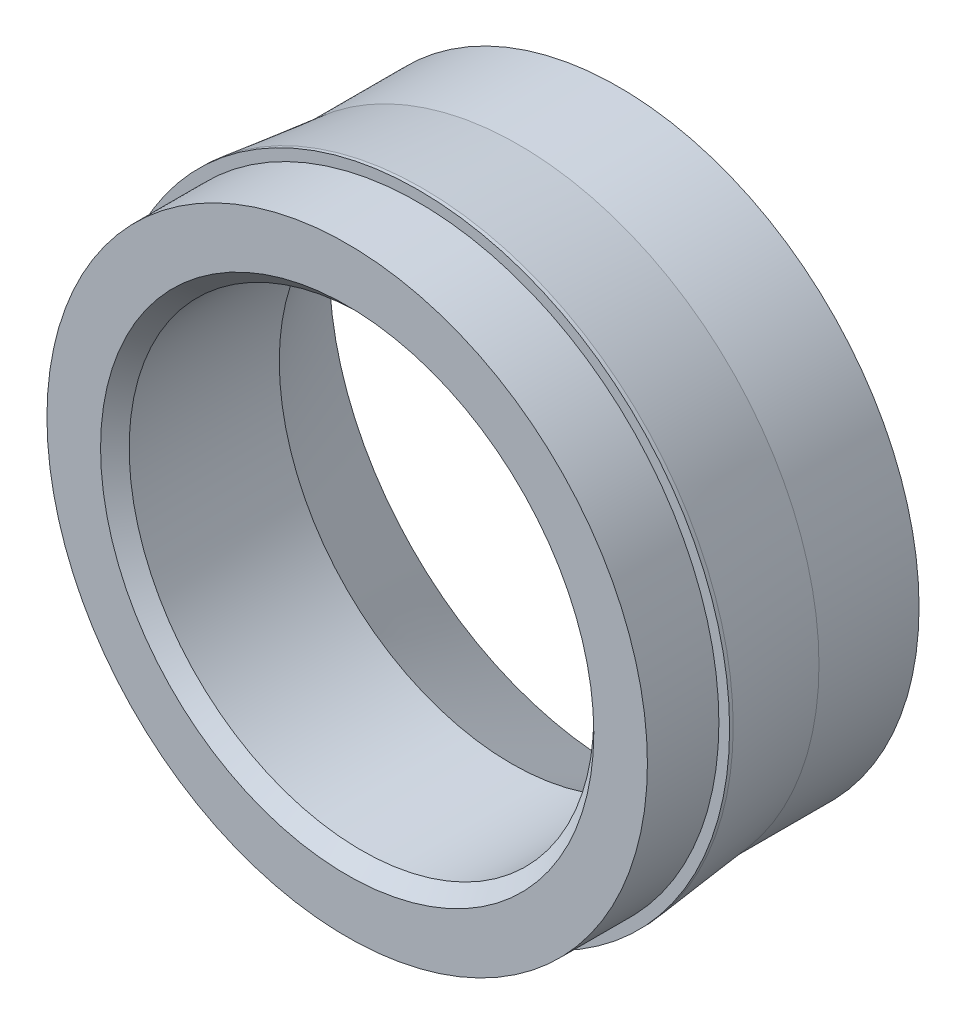
ISO-10303-21;
HEADER;
FILE_DESCRIPTION(('STEP AP214'),'2;1');
FILE_NAME('part.step','',(''),(''),'','','');
FILE_SCHEMA(('AUTOMOTIVE_DESIGN { 1 0 10303 214 1 1 1 1 }'));
ENDSEC;
DATA;
#1=APPLICATION_CONTEXT('core data for automotive mechanical design processes');
#2=APPLICATION_PROTOCOL_DEFINITION('international standard','automotive_design',2000,#1);
#3=PRODUCT_CONTEXT('',#1,'mechanical');
#4=PRODUCT('Part','Part','',(#3));
#5=PRODUCT_RELATED_PRODUCT_CATEGORY('part','',(#4));
#6=PRODUCT_DEFINITION_FORMATION('','',#4);
#7=PRODUCT_DEFINITION_CONTEXT('part definition',#1,'design');
#8=PRODUCT_DEFINITION('design','',#6,#7);
#9=PRODUCT_DEFINITION_SHAPE('','',#8);
#10=(LENGTH_UNIT() NAMED_UNIT(*) SI_UNIT(.MILLI.,.METRE.));
#11=(NAMED_UNIT(*) PLANE_ANGLE_UNIT() SI_UNIT($,.RADIAN.));
#12=(NAMED_UNIT(*) SI_UNIT($,.STERADIAN.) SOLID_ANGLE_UNIT());
#13=UNCERTAINTY_MEASURE_WITH_UNIT(LENGTH_MEASURE(1.E-05),#10,'distance_accuracy_value','');
#14=(GEOMETRIC_REPRESENTATION_CONTEXT(3) GLOBAL_UNCERTAINTY_ASSIGNED_CONTEXT((#13)) GLOBAL_UNIT_ASSIGNED_CONTEXT((#10,
#11,#12)) REPRESENTATION_CONTEXT('',''));
#15=CARTESIAN_POINT('',(0.,0.,0.));
#16=DIRECTION('',(0.,0.,1.));
#17=DIRECTION('',(1.,0.,0.));
#18=AXIS2_PLACEMENT_3D('',#15,#16,#17);
#19=CARTESIAN_POINT('',(0.,0.,2.8));
#20=DIRECTION('',(0.,0.,-1.));
#21=DIRECTION('',(-1.,0.,0.));
#22=AXIS2_PLACEMENT_3D('',#19,#20,#21);
#23=CYLINDRICAL_SURFACE('',#22,4.35);
#24=CARTESIAN_POINT('',(0.,0.,2.8));
#25=DIRECTION('',(0.,0.,-1.));
#26=DIRECTION('',(-1.,0.,0.));
#27=AXIS2_PLACEMENT_3D('',#24,#25,#26);
#28=CIRCLE('',#27,4.35);
#29=CARTESIAN_POINT('',(-4.35,0.,2.8));
#30=VERTEX_POINT('',#29);
#31=EDGE_CURVE('E18',#30,#30,#28,.F.);
#32=ORIENTED_EDGE('',*,*,#31,.F.);
#33=EDGE_LOOP('',(#32));
#34=FACE_BOUND('',#33,.T.);
#35=CARTESIAN_POINT('',(0.,0.,2.74999999999181));
#36=DIRECTION('',(0.,0.,1.));
#37=DIRECTION('',(1.,0.,0.));
#38=AXIS2_PLACEMENT_3D('',#35,#36,#37);
#39=CIRCLE('',#38,4.3500000000023);
#40=CARTESIAN_POINT('',(4.3500000000023,0.,2.74999999999181));
#41=VERTEX_POINT('',#40);
#42=EDGE_CURVE('E34',#41,#41,#39,.F.);
#43=ORIENTED_EDGE('',*,*,#42,.F.);
#44=EDGE_LOOP('',(#43));
#45=FACE_BOUND('',#44,.T.);
#46=ADVANCED_FACE('F15',(#34,#45),#23,.T.);
#47=CARTESIAN_POINT('',(0.,0.,2.74999999982128));
#48=DIRECTION('',(0.,0.,1.));
#49=DIRECTION('',(1.,0.,0.));
#50=AXIS2_PLACEMENT_3D('',#47,#48,#49);
#51=CONICAL_SURFACE('',#50,4.34999999998098,0.110657221177939);
#52=ORIENTED_EDGE('',*,*,#42,.T.);
#53=EDGE_LOOP('',(#52));
#54=FACE_BOUND('',#53,.T.);
#55=CARTESIAN_POINT('',(0.,0.,1.4));
#56=DIRECTION('',(0.,0.,1.));
#57=DIRECTION('',(1.,0.,0.));
#58=AXIS2_PLACEMENT_3D('',#55,#56,#57);
#59=CIRCLE('',#58,4.2);
#60=CARTESIAN_POINT('',(4.2,0.,1.4));
#61=VERTEX_POINT('',#60);
#62=EDGE_CURVE('E30',#61,#61,#59,.F.);
#63=ORIENTED_EDGE('',*,*,#62,.F.);
#64=EDGE_LOOP('',(#63));
#65=FACE_BOUND('',#64,.T.);
#66=ADVANCED_FACE('F57',(#54,#65),#51,.T.);
#67=CARTESIAN_POINT('',(0.,0.,2.8));
#68=DIRECTION('',(0.,0.,1.));
#69=DIRECTION('',(1.,0.,0.));
#70=AXIS2_PLACEMENT_3D('',#67,#68,#69);
#71=PLANE('',#70);
#72=CARTESIAN_POINT('',(0.,0.,2.8));
#73=DIRECTION('',(0.,0.,1.));
#74=DIRECTION('',(1.,0.,0.));
#75=AXIS2_PLACEMENT_3D('',#72,#73,#74);
#76=CIRCLE('',#75,4.2);
#77=CARTESIAN_POINT('',(4.2,0.,2.8));
#78=VERTEX_POINT('',#77);
#79=EDGE_CURVE('E33',#78,#78,#76,.T.);
#80=ORIENTED_EDGE('',*,*,#79,.F.);
#81=EDGE_LOOP('',(#80));
#82=FACE_BOUND('',#81,.T.);
#83=ORIENTED_EDGE('',*,*,#31,.T.);
#84=EDGE_LOOP('',(#83));
#85=FACE_BOUND('',#84,.T.);
#86=ADVANCED_FACE('F53',(#82,#85),#71,.T.);
#87=CARTESIAN_POINT('',(0.,0.,0.));
#88=DIRECTION('',(0.,0.,1.));
#89=DIRECTION('',(1.,0.,0.));
#90=AXIS2_PLACEMENT_3D('',#87,#88,#89);
#91=CYLINDRICAL_SURFACE('',#90,4.2);
#92=CARTESIAN_POINT('',(0.,0.,0.));
#93=DIRECTION('',(0.,0.,1.));
#94=DIRECTION('',(1.,0.,0.));
#95=AXIS2_PLACEMENT_3D('',#92,#93,#94);
#96=CIRCLE('',#95,4.2);
#97=CARTESIAN_POINT('',(4.2,0.,0.));
#98=VERTEX_POINT('',#97);
#99=EDGE_CURVE('E45',#98,#98,#96,.T.);
#100=ORIENTED_EDGE('',*,*,#99,.T.);
#101=EDGE_LOOP('',(#100));
#102=FACE_BOUND('',#101,.T.);
#103=ORIENTED_EDGE('',*,*,#62,.T.);
#104=EDGE_LOOP('',(#103));
#105=FACE_BOUND('',#104,.T.);
#106=ADVANCED_FACE('F56',(#102,#105),#91,.T.);
#107=CARTESIAN_POINT('',(0.,0.,0.));
#108=DIRECTION('',(0.,0.,1.));
#109=DIRECTION('',(1.,0.,0.));
#110=AXIS2_PLACEMENT_3D('',#107,#108,#109);
#111=CYLINDRICAL_SURFACE('',#110,4.2);
#112=ORIENTED_EDGE('',*,*,#79,.T.);
#113=EDGE_LOOP('',(#112));
#114=FACE_BOUND('',#113,.T.);
#115=CARTESIAN_POINT('',(0.,0.,3.8));
#116=DIRECTION('',(0.,0.,1.));
#117=DIRECTION('',(1.,0.,0.));
#118=AXIS2_PLACEMENT_3D('',#115,#116,#117);
#119=CIRCLE('',#118,4.2);
#120=CARTESIAN_POINT('',(4.2,0.,3.8));
#121=VERTEX_POINT('',#120);
#122=EDGE_CURVE('E42',#121,#121,#119,.T.);
#123=ORIENTED_EDGE('',*,*,#122,.F.);
#124=EDGE_LOOP('',(#123));
#125=FACE_BOUND('',#124,.T.);
#126=ADVANCED_FACE('F50',(#114,#125),#111,.T.);
#127=CARTESIAN_POINT('',(0.,0.,0.));
#128=DIRECTION('',(0.,0.,1.));
#129=DIRECTION('',(1.,0.,0.));
#130=AXIS2_PLACEMENT_3D('',#127,#128,#129);
#131=PLANE('',#130);
#132=CARTESIAN_POINT('',(0.,0.,0.));
#133=DIRECTION('',(0.,0.,-1.));
#134=DIRECTION('',(-1.,0.,0.));
#135=AXIS2_PLACEMENT_3D('',#132,#133,#134);
#136=CIRCLE('',#135,4.04999999998002);
#137=CARTESIAN_POINT('',(-4.04999999998002,0.,0.));
#138=VERTEX_POINT('',#137);
#139=EDGE_CURVE('E39',#138,#138,#136,.F.);
#140=ORIENTED_EDGE('',*,*,#139,.T.);
#141=EDGE_LOOP('',(#140));
#142=FACE_BOUND('',#141,.T.);
#143=ORIENTED_EDGE('',*,*,#99,.F.);
#144=EDGE_LOOP('',(#143));
#145=FACE_BOUND('',#144,.T.);
#146=ADVANCED_FACE('F77',(#142,#145),#131,.F.);
#147=CARTESIAN_POINT('',(0.,0.,3.8));
#148=DIRECTION('',(0.,0.,1.));
#149=DIRECTION('',(1.,0.,0.));
#150=AXIS2_PLACEMENT_3D('',#147,#148,#149);
#151=PLANE('',#150);
#152=CARTESIAN_POINT('',(0.,0.,3.80000000001246));
#153=DIRECTION('',(0.,0.,1.));
#154=DIRECTION('',(1.,0.,0.));
#155=AXIS2_PLACEMENT_3D('',#152,#153,#154);
#156=CIRCLE('',#155,3.45000000004347);
#157=CARTESIAN_POINT('',(3.45000000004347,0.,3.80000000001246));
#158=VERTEX_POINT('',#157);
#159=EDGE_CURVE('E27',#158,#158,#156,.F.);
#160=ORIENTED_EDGE('',*,*,#159,.T.);
#161=EDGE_LOOP('',(#160));
#162=FACE_BOUND('',#161,.T.);
#163=ORIENTED_EDGE('',*,*,#122,.T.);
#164=EDGE_LOOP('',(#163));
#165=FACE_BOUND('',#164,.T.);
#166=ADVANCED_FACE('F94',(#162,#165),#151,.T.);
#167=CARTESIAN_POINT('',(0.,0.,5.6843418860808E-11));
#168=DIRECTION('',(0.,0.,-1.));
#169=DIRECTION('',(-1.,0.,0.));
#170=AXIS2_PLACEMENT_3D('',#167,#168,#169);
#171=CONICAL_SURFACE('',#170,4.0499999999497,0.489957326216357);
#172=ORIENTED_EDGE('',*,*,#139,.F.);
#173=EDGE_LOOP('',(#172));
#174=FACE_BOUND('',#173,.T.);
#175=CARTESIAN_POINT('',(0.,0.,1.5));
#176=DIRECTION('',(0.,0.,1.));
#177=DIRECTION('',(1.,0.,0.));
#178=AXIS2_PLACEMENT_3D('',#175,#176,#177);
#179=CIRCLE('',#178,3.25);
#180=CARTESIAN_POINT('',(3.25,0.,1.5));
#181=VERTEX_POINT('',#180);
#182=EDGE_CURVE('E22',#181,#181,#179,.T.);
#183=ORIENTED_EDGE('',*,*,#182,.T.);
#184=EDGE_LOOP('',(#183));
#185=FACE_BOUND('',#184,.T.);
#186=ADVANCED_FACE('F87',(#174,#185),#171,.F.);
#187=CARTESIAN_POINT('',(0.,0.,3.80000000001246));
#188=DIRECTION('',(0.,0.,1.));
#189=DIRECTION('',(1.,0.,0.));
#190=AXIS2_PLACEMENT_3D('',#187,#188,#189);
#191=CONICAL_SURFACE('',#190,3.45000000004347,0.785398163539557);
#192=CARTESIAN_POINT('',(0.,0.,3.6));
#193=DIRECTION('',(0.,0.,1.));
#194=DIRECTION('',(1.,0.,0.));
#195=AXIS2_PLACEMENT_3D('',#192,#193,#194);
#196=CIRCLE('',#195,3.25);
#197=CARTESIAN_POINT('',(3.25,0.,3.6));
#198=VERTEX_POINT('',#197);
#199=EDGE_CURVE('E10',#198,#198,#196,.F.);
#200=ORIENTED_EDGE('',*,*,#199,.T.);
#201=EDGE_LOOP('',(#200));
#202=FACE_BOUND('',#201,.T.);
#203=ORIENTED_EDGE('',*,*,#159,.F.);
#204=EDGE_LOOP('',(#203));
#205=FACE_BOUND('',#204,.T.);
#206=ADVANCED_FACE('F81',(#202,#205),#191,.F.);
#207=CARTESIAN_POINT('',(0.,0.,0.));
#208=DIRECTION('',(0.,0.,1.));
#209=DIRECTION('',(1.,0.,0.));
#210=AXIS2_PLACEMENT_3D('',#207,#208,#209);
#211=CYLINDRICAL_SURFACE('',#210,3.25);
#212=ORIENTED_EDGE('',*,*,#182,.F.);
#213=EDGE_LOOP('',(#212));
#214=FACE_BOUND('',#213,.T.);
#215=ORIENTED_EDGE('',*,*,#199,.F.);
#216=EDGE_LOOP('',(#215));
#217=FACE_BOUND('',#216,.T.);
#218=ADVANCED_FACE('F79',(#214,#217),#211,.F.);
#219=CLOSED_SHELL('',(#46,#66,#86,#106,#126,#146,#166,#186,#206,#218));
#220=MANIFOLD_SOLID_BREP('B1',#219);
#221=ADVANCED_BREP_SHAPE_REPRESENTATION('',(#18,#220),#14);
#222=SHAPE_DEFINITION_REPRESENTATION(#9,#221);
ENDSEC;
END-ISO-10303-21;
